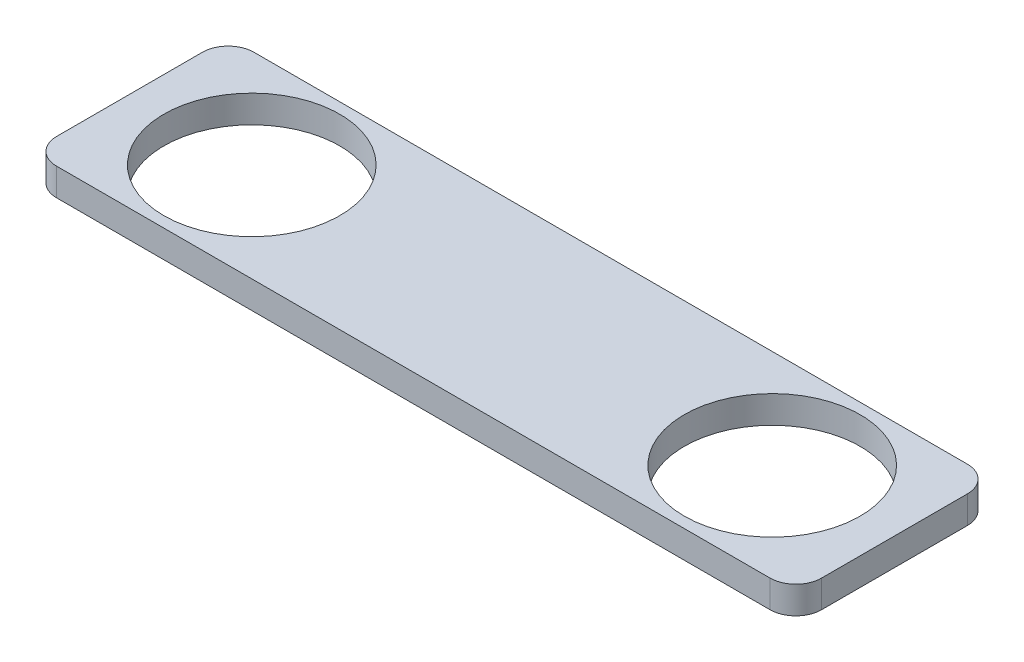
ISO-10303-21;
HEADER;
FILE_DESCRIPTION(('STEP AP214'),'2;1');
FILE_NAME('part.step','',(''),(''),'','','');
FILE_SCHEMA(('AUTOMOTIVE_DESIGN { 1 0 10303 214 1 1 1 1 }'));
ENDSEC;
DATA;
#1=APPLICATION_CONTEXT('core data for automotive mechanical design processes');
#2=APPLICATION_PROTOCOL_DEFINITION('international standard','automotive_design',2000,#1);
#3=PRODUCT_CONTEXT('',#1,'mechanical');
#4=PRODUCT('Part','Part','',(#3));
#5=PRODUCT_RELATED_PRODUCT_CATEGORY('part','',(#4));
#6=PRODUCT_DEFINITION_FORMATION('','',#4);
#7=PRODUCT_DEFINITION_CONTEXT('part definition',#1,'design');
#8=PRODUCT_DEFINITION('design','',#6,#7);
#9=PRODUCT_DEFINITION_SHAPE('','',#8);
#10=(LENGTH_UNIT() NAMED_UNIT(*) SI_UNIT(.MILLI.,.METRE.));
#11=(NAMED_UNIT(*) PLANE_ANGLE_UNIT() SI_UNIT($,.RADIAN.));
#12=(NAMED_UNIT(*) SI_UNIT($,.STERADIAN.) SOLID_ANGLE_UNIT());
#13=UNCERTAINTY_MEASURE_WITH_UNIT(LENGTH_MEASURE(1.E-05),#10,'distance_accuracy_value','');
#14=(GEOMETRIC_REPRESENTATION_CONTEXT(3) GLOBAL_UNCERTAINTY_ASSIGNED_CONTEXT((#13)) GLOBAL_UNIT_ASSIGNED_CONTEXT((#10,
#11,#12)) REPRESENTATION_CONTEXT('',''));
#15=CARTESIAN_POINT('',(0.,0.,0.));
#16=DIRECTION('',(0.,0.,1.));
#17=DIRECTION('',(1.,0.,0.));
#18=AXIS2_PLACEMENT_3D('',#15,#16,#17);
#19=CARTESIAN_POINT('',(-44.578,3.2,11.5));
#20=DIRECTION('',(1.,0.,0.));
#21=DIRECTION('',(0.,0.,1.));
#22=AXIS2_PLACEMENT_3D('',#19,#20,#21);
#23=PLANE('',#22);
#24=DIRECTION('',(0.,0.,1.));
#25=VECTOR('',#24,1.);
#26=CARTESIAN_POINT('',(-44.578,3.2,11.5));
#27=LINE('',#26,#25);
#28=CARTESIAN_POINT('',(-44.578,3.2,-8.5));
#29=VERTEX_POINT('',#28);
#30=CARTESIAN_POINT('',(-44.578,3.2,8.5));
#31=VERTEX_POINT('',#30);
#32=EDGE_CURVE('E146',#29,#31,#27,.T.);
#33=ORIENTED_EDGE('',*,*,#32,.F.);
#34=DIRECTION('',(0.,-1.,0.));
#35=VECTOR('',#34,1.);
#36=CARTESIAN_POINT('',(-44.578,3.2,-8.5));
#37=LINE('',#36,#35);
#38=CARTESIAN_POINT('',(-44.578,0.,-8.5));
#39=VERTEX_POINT('',#38);
#40=EDGE_CURVE('E11',#29,#39,#37,.T.);
#41=ORIENTED_EDGE('',*,*,#40,.T.);
#42=DIRECTION('',(0.,0.,-1.));
#43=VECTOR('',#42,1.);
#44=CARTESIAN_POINT('',(-44.578,0.,0.));
#45=LINE('',#44,#43);
#46=CARTESIAN_POINT('',(-44.578,0.,8.5));
#47=VERTEX_POINT('',#46);
#48=EDGE_CURVE('E147',#39,#47,#45,.F.);
#49=ORIENTED_EDGE('',*,*,#48,.T.);
#50=DIRECTION('',(0.,-1.,0.));
#51=VECTOR('',#50,1.);
#52=CARTESIAN_POINT('',(-44.578,3.2,8.5));
#53=LINE('',#52,#51);
#54=EDGE_CURVE('E51',#47,#31,#53,.F.);
#55=ORIENTED_EDGE('',*,*,#54,.T.);
#56=EDGE_LOOP('',(#33,#41,#49,#55));
#57=FACE_BOUND('',#56,.T.);
#58=ADVANCED_FACE('F43',(#57),#23,.F.);
#59=CARTESIAN_POINT('',(-44.578,3.2,11.5));
#60=DIRECTION('',(0.,0.,-1.));
#61=DIRECTION('',(1.,0.,0.));
#62=AXIS2_PLACEMENT_3D('',#59,#60,#61);
#63=PLANE('',#62);
#64=DIRECTION('',(1.,0.,0.));
#65=VECTOR('',#64,1.);
#66=CARTESIAN_POINT('',(0.,0.,11.5));
#67=LINE('',#66,#65);
#68=CARTESIAN_POINT('',(-41.578,0.,11.5));
#69=VERTEX_POINT('',#68);
#70=CARTESIAN_POINT('',(41.578,0.,11.5));
#71=VERTEX_POINT('',#70);
#72=EDGE_CURVE('E169',#69,#71,#67,.T.);
#73=ORIENTED_EDGE('',*,*,#72,.T.);
#74=DIRECTION('',(0.,-1.,0.));
#75=VECTOR('',#74,1.);
#76=CARTESIAN_POINT('',(41.578,3.2,11.5));
#77=LINE('',#76,#75);
#78=CARTESIAN_POINT('',(41.578,3.2,11.5));
#79=VERTEX_POINT('',#78);
#80=EDGE_CURVE('E134',#71,#79,#77,.F.);
#81=ORIENTED_EDGE('',*,*,#80,.T.);
#82=DIRECTION('',(1.,0.,0.));
#83=VECTOR('',#82,1.);
#84=CARTESIAN_POINT('',(-44.578,3.2,11.5));
#85=LINE('',#84,#83);
#86=CARTESIAN_POINT('',(-41.578,3.2,11.5));
#87=VERTEX_POINT('',#86);
#88=EDGE_CURVE('E157',#87,#79,#85,.T.);
#89=ORIENTED_EDGE('',*,*,#88,.F.);
#90=DIRECTION('',(0.,-1.,0.));
#91=VECTOR('',#90,1.);
#92=CARTESIAN_POINT('',(-41.578,3.2,11.5));
#93=LINE('',#92,#91);
#94=EDGE_CURVE('E137',#87,#69,#93,.T.);
#95=ORIENTED_EDGE('',*,*,#94,.T.);
#96=EDGE_LOOP('',(#73,#81,#89,#95));
#97=FACE_BOUND('',#96,.T.);
#98=ADVANCED_FACE('F200',(#97),#63,.F.);
#99=CARTESIAN_POINT('',(44.578,3.2,11.5));
#100=DIRECTION('',(-1.,0.,0.));
#101=DIRECTION('',(0.,0.,-1.));
#102=AXIS2_PLACEMENT_3D('',#99,#100,#101);
#103=PLANE('',#102);
#104=DIRECTION('',(0.,0.,-1.));
#105=VECTOR('',#104,1.);
#106=CARTESIAN_POINT('',(44.578,0.,0.));
#107=LINE('',#106,#105);
#108=CARTESIAN_POINT('',(44.578,0.,8.5));
#109=VERTEX_POINT('',#108);
#110=CARTESIAN_POINT('',(44.578,0.,-8.5));
#111=VERTEX_POINT('',#110);
#112=EDGE_CURVE('E113',#109,#111,#107,.T.);
#113=ORIENTED_EDGE('',*,*,#112,.T.);
#114=DIRECTION('',(0.,-1.,0.));
#115=VECTOR('',#114,1.);
#116=CARTESIAN_POINT('',(44.578,3.2,-8.5));
#117=LINE('',#116,#115);
#118=CARTESIAN_POINT('',(44.578,3.2,-8.5));
#119=VERTEX_POINT('',#118);
#120=EDGE_CURVE('E119',#111,#119,#117,.F.);
#121=ORIENTED_EDGE('',*,*,#120,.T.);
#122=DIRECTION('',(0.,0.,-1.));
#123=VECTOR('',#122,1.);
#124=CARTESIAN_POINT('',(44.578,3.2,11.5));
#125=LINE('',#124,#123);
#126=CARTESIAN_POINT('',(44.578,3.2,8.5));
#127=VERTEX_POINT('',#126);
#128=EDGE_CURVE('E116',#127,#119,#125,.T.);
#129=ORIENTED_EDGE('',*,*,#128,.F.);
#130=DIRECTION('',(0.,-1.,0.));
#131=VECTOR('',#130,1.);
#132=CARTESIAN_POINT('',(44.578,3.2,8.5));
#133=LINE('',#132,#131);
#134=EDGE_CURVE('E109',#127,#109,#133,.T.);
#135=ORIENTED_EDGE('',*,*,#134,.T.);
#136=EDGE_LOOP('',(#113,#121,#129,#135));
#137=FACE_BOUND('',#136,.T.);
#138=ADVANCED_FACE('F111',(#137),#103,.F.);
#139=CARTESIAN_POINT('',(-44.578,3.2,-11.5));
#140=DIRECTION('',(0.,0.,1.));
#141=DIRECTION('',(-1.,0.,0.));
#142=AXIS2_PLACEMENT_3D('',#139,#140,#141);
#143=PLANE('',#142);
#144=DIRECTION('',(-1.,0.,0.));
#145=VECTOR('',#144,1.);
#146=CARTESIAN_POINT('',(-44.578,3.2,-11.5));
#147=LINE('',#146,#145);
#148=CARTESIAN_POINT('',(41.578,3.2,-11.5));
#149=VERTEX_POINT('',#148);
#150=CARTESIAN_POINT('',(-41.578,3.2,-11.5));
#151=VERTEX_POINT('',#150);
#152=EDGE_CURVE('E158',#149,#151,#147,.T.);
#153=ORIENTED_EDGE('',*,*,#152,.F.);
#154=DIRECTION('',(0.,-1.,0.));
#155=VECTOR('',#154,1.);
#156=CARTESIAN_POINT('',(41.578,3.2,-11.5));
#157=LINE('',#156,#155);
#158=CARTESIAN_POINT('',(41.578,0.,-11.5));
#159=VERTEX_POINT('',#158);
#160=EDGE_CURVE('E190',#149,#159,#157,.T.);
#161=ORIENTED_EDGE('',*,*,#160,.T.);
#162=DIRECTION('',(1.,0.,0.));
#163=VECTOR('',#162,1.);
#164=CARTESIAN_POINT('',(0.,0.,-11.5));
#165=LINE('',#164,#163);
#166=CARTESIAN_POINT('',(-41.578,0.,-11.5));
#167=VERTEX_POINT('',#166);
#168=EDGE_CURVE('E129',#159,#167,#165,.F.);
#169=ORIENTED_EDGE('',*,*,#168,.T.);
#170=DIRECTION('',(0.,-1.,0.));
#171=VECTOR('',#170,1.);
#172=CARTESIAN_POINT('',(-41.578,3.2,-11.5));
#173=LINE('',#172,#171);
#174=EDGE_CURVE('E187',#167,#151,#173,.F.);
#175=ORIENTED_EDGE('',*,*,#174,.T.);
#176=EDGE_LOOP('',(#153,#161,#169,#175));
#177=FACE_BOUND('',#176,.T.);
#178=ADVANCED_FACE('F194',(#177),#143,.F.);
#179=CARTESIAN_POINT('',(30.328,3.2,0.));
#180=DIRECTION('',(0.,-1.,0.));
#181=DIRECTION('',(0.,0.,-1.));
#182=AXIS2_PLACEMENT_3D('',#179,#180,#181);
#183=CYLINDRICAL_SURFACE('',#182,10.25);
#184=CARTESIAN_POINT('',(30.328,3.2,0.));
#185=DIRECTION('',(0.,1.,0.));
#186=DIRECTION('',(0.,0.,1.));
#187=AXIS2_PLACEMENT_3D('',#184,#185,#186);
#188=CIRCLE('',#187,10.25);
#189=CARTESIAN_POINT('',(30.328,3.2,10.25));
#190=VERTEX_POINT('',#189);
#191=EDGE_CURVE('E160',#190,#190,#188,.T.);
#192=ORIENTED_EDGE('',*,*,#191,.T.);
#193=EDGE_LOOP('',(#192));
#194=FACE_BOUND('',#193,.T.);
#195=CARTESIAN_POINT('',(30.328,0.,0.));
#196=DIRECTION('',(0.,1.,0.));
#197=DIRECTION('',(0.,0.,1.));
#198=AXIS2_PLACEMENT_3D('',#195,#196,#197);
#199=CIRCLE('',#198,10.25);
#200=CARTESIAN_POINT('',(30.328,0.,10.25));
#201=VERTEX_POINT('',#200);
#202=EDGE_CURVE('E171',#201,#201,#199,.T.);
#203=ORIENTED_EDGE('',*,*,#202,.F.);
#204=EDGE_LOOP('',(#203));
#205=FACE_BOUND('',#204,.T.);
#206=ADVANCED_FACE('F219',(#194,#205),#183,.F.);
#207=CARTESIAN_POINT('',(-30.328,3.2,0.));
#208=DIRECTION('',(0.,-1.,0.));
#209=DIRECTION('',(0.,0.,-1.));
#210=AXIS2_PLACEMENT_3D('',#207,#208,#209);
#211=CYLINDRICAL_SURFACE('',#210,10.25);
#212=CARTESIAN_POINT('',(-30.328,3.2,0.));
#213=DIRECTION('',(0.,1.,0.));
#214=DIRECTION('',(0.,0.,1.));
#215=AXIS2_PLACEMENT_3D('',#212,#213,#214);
#216=CIRCLE('',#215,10.25);
#217=CARTESIAN_POINT('',(-30.328,3.2,10.25));
#218=VERTEX_POINT('',#217);
#219=EDGE_CURVE('E120',#218,#218,#216,.T.);
#220=ORIENTED_EDGE('',*,*,#219,.T.);
#221=EDGE_LOOP('',(#220));
#222=FACE_BOUND('',#221,.T.);
#223=CARTESIAN_POINT('',(-30.328,0.,0.));
#224=DIRECTION('',(0.,1.,0.));
#225=DIRECTION('',(0.,0.,1.));
#226=AXIS2_PLACEMENT_3D('',#223,#224,#225);
#227=CIRCLE('',#226,10.25);
#228=CARTESIAN_POINT('',(-30.328,0.,10.25));
#229=VERTEX_POINT('',#228);
#230=EDGE_CURVE('E177',#229,#229,#227,.T.);
#231=ORIENTED_EDGE('',*,*,#230,.F.);
#232=EDGE_LOOP('',(#231));
#233=FACE_BOUND('',#232,.T.);
#234=ADVANCED_FACE('F222',(#222,#233),#211,.F.);
#235=CARTESIAN_POINT('',(0.,3.2,0.));
#236=DIRECTION('',(0.,-1.,0.));
#237=DIRECTION('',(0.,0.,-1.));
#238=AXIS2_PLACEMENT_3D('',#235,#236,#237);
#239=PLANE('',#238);
#240=ORIENTED_EDGE('',*,*,#128,.T.);
#241=CARTESIAN_POINT('',(41.578,3.2,-8.5));
#242=DIRECTION('',(0.,-1.,0.));
#243=DIRECTION('',(0.,0.,-1.));
#244=AXIS2_PLACEMENT_3D('',#241,#242,#243);
#245=CIRCLE('',#244,3.);
#246=EDGE_CURVE('E185',#119,#149,#245,.F.);
#247=ORIENTED_EDGE('',*,*,#246,.T.);
#248=ORIENTED_EDGE('',*,*,#152,.T.);
#249=CARTESIAN_POINT('',(-41.578,3.2,-8.5));
#250=DIRECTION('',(0.,-1.,0.));
#251=DIRECTION('',(0.,0.,-1.));
#252=AXIS2_PLACEMENT_3D('',#249,#250,#251);
#253=CIRCLE('',#252,3.);
#254=EDGE_CURVE('E156',#151,#29,#253,.F.);
#255=ORIENTED_EDGE('',*,*,#254,.T.);
#256=ORIENTED_EDGE('',*,*,#32,.T.);
#257=CARTESIAN_POINT('',(-41.578,3.2,8.5));
#258=DIRECTION('',(0.,-1.,0.));
#259=DIRECTION('',(0.,0.,-1.));
#260=AXIS2_PLACEMENT_3D('',#257,#258,#259);
#261=CIRCLE('',#260,3.);
#262=EDGE_CURVE('E153',#31,#87,#261,.F.);
#263=ORIENTED_EDGE('',*,*,#262,.T.);
#264=ORIENTED_EDGE('',*,*,#88,.T.);
#265=CARTESIAN_POINT('',(41.578,3.2,8.5));
#266=DIRECTION('',(0.,-1.,0.));
#267=DIRECTION('',(0.,0.,-1.));
#268=AXIS2_PLACEMENT_3D('',#265,#266,#267);
#269=CIRCLE('',#268,3.);
#270=EDGE_CURVE('E183',#79,#127,#269,.F.);
#271=ORIENTED_EDGE('',*,*,#270,.T.);
#272=EDGE_LOOP('',(#240,#247,#248,#255,#256,#263,#264,#271));
#273=FACE_BOUND('',#272,.T.);
#274=ORIENTED_EDGE('',*,*,#191,.F.);
#275=EDGE_LOOP('',(#274));
#276=FACE_BOUND('',#275,.T.);
#277=ORIENTED_EDGE('',*,*,#219,.F.);
#278=EDGE_LOOP('',(#277));
#279=FACE_BOUND('',#278,.T.);
#280=ADVANCED_FACE('F150',(#273,#276,#279),#239,.F.);
#281=CARTESIAN_POINT('',(0.,0.,0.));
#282=DIRECTION('',(0.,-1.,0.));
#283=DIRECTION('',(0.,0.,-1.));
#284=AXIS2_PLACEMENT_3D('',#281,#282,#283);
#285=PLANE('',#284);
#286=ORIENTED_EDGE('',*,*,#168,.F.);
#287=CARTESIAN_POINT('',(41.578,0.,-8.5));
#288=DIRECTION('',(0.,-1.,0.));
#289=DIRECTION('',(0.,0.,-1.));
#290=AXIS2_PLACEMENT_3D('',#287,#288,#289);
#291=CIRCLE('',#290,3.);
#292=EDGE_CURVE('E128',#159,#111,#291,.T.);
#293=ORIENTED_EDGE('',*,*,#292,.T.);
#294=ORIENTED_EDGE('',*,*,#112,.F.);
#295=CARTESIAN_POINT('',(41.578,0.,8.5));
#296=DIRECTION('',(0.,-1.,0.));
#297=DIRECTION('',(0.,0.,-1.));
#298=AXIS2_PLACEMENT_3D('',#295,#296,#297);
#299=CIRCLE('',#298,3.);
#300=EDGE_CURVE('E125',#109,#71,#299,.T.);
#301=ORIENTED_EDGE('',*,*,#300,.T.);
#302=ORIENTED_EDGE('',*,*,#72,.F.);
#303=CARTESIAN_POINT('',(-41.578,0.,8.5));
#304=DIRECTION('',(0.,-1.,0.));
#305=DIRECTION('',(0.,0.,-1.));
#306=AXIS2_PLACEMENT_3D('',#303,#304,#305);
#307=CIRCLE('',#306,3.);
#308=EDGE_CURVE('E58',#69,#47,#307,.T.);
#309=ORIENTED_EDGE('',*,*,#308,.T.);
#310=ORIENTED_EDGE('',*,*,#48,.F.);
#311=CARTESIAN_POINT('',(-41.578,0.,-8.5));
#312=DIRECTION('',(0.,-1.,0.));
#313=DIRECTION('',(0.,0.,-1.));
#314=AXIS2_PLACEMENT_3D('',#311,#312,#313);
#315=CIRCLE('',#314,3.);
#316=EDGE_CURVE('E135',#39,#167,#315,.T.);
#317=ORIENTED_EDGE('',*,*,#316,.T.);
#318=EDGE_LOOP('',(#286,#293,#294,#301,#302,#309,#310,#317));
#319=FACE_BOUND('',#318,.T.);
#320=ORIENTED_EDGE('',*,*,#202,.T.);
#321=EDGE_LOOP('',(#320));
#322=FACE_BOUND('',#321,.T.);
#323=ORIENTED_EDGE('',*,*,#230,.T.);
#324=EDGE_LOOP('',(#323));
#325=FACE_BOUND('',#324,.T.);
#326=ADVANCED_FACE('F123',(#319,#322,#325),#285,.T.);
#327=CARTESIAN_POINT('',(41.578,3.2,-8.5));
#328=DIRECTION('',(0.,1.,0.));
#329=DIRECTION('',(0.,0.,1.));
#330=AXIS2_PLACEMENT_3D('',#327,#328,#329);
#331=CYLINDRICAL_SURFACE('',#330,3.);
#332=ORIENTED_EDGE('',*,*,#292,.F.);
#333=ORIENTED_EDGE('',*,*,#160,.F.);
#334=ORIENTED_EDGE('',*,*,#246,.F.);
#335=ORIENTED_EDGE('',*,*,#120,.F.);
#336=EDGE_LOOP('',(#332,#333,#334,#335));
#337=FACE_BOUND('',#336,.T.);
#338=ADVANCED_FACE('F198',(#337),#331,.T.);
#339=CARTESIAN_POINT('',(41.578,3.2,8.5));
#340=DIRECTION('',(0.,1.,0.));
#341=DIRECTION('',(0.,0.,1.));
#342=AXIS2_PLACEMENT_3D('',#339,#340,#341);
#343=CYLINDRICAL_SURFACE('',#342,3.);
#344=ORIENTED_EDGE('',*,*,#300,.F.);
#345=ORIENTED_EDGE('',*,*,#134,.F.);
#346=ORIENTED_EDGE('',*,*,#270,.F.);
#347=ORIENTED_EDGE('',*,*,#80,.F.);
#348=EDGE_LOOP('',(#344,#345,#346,#347));
#349=FACE_BOUND('',#348,.T.);
#350=ADVANCED_FACE('F132',(#349),#343,.T.);
#351=CARTESIAN_POINT('',(-41.578,3.2,-8.5));
#352=DIRECTION('',(0.,1.,0.));
#353=DIRECTION('',(0.,0.,1.));
#354=AXIS2_PLACEMENT_3D('',#351,#352,#353);
#355=CYLINDRICAL_SURFACE('',#354,3.);
#356=ORIENTED_EDGE('',*,*,#316,.F.);
#357=ORIENTED_EDGE('',*,*,#40,.F.);
#358=ORIENTED_EDGE('',*,*,#254,.F.);
#359=ORIENTED_EDGE('',*,*,#174,.F.);
#360=EDGE_LOOP('',(#356,#357,#358,#359));
#361=FACE_BOUND('',#360,.T.);
#362=ADVANCED_FACE('F203',(#361),#355,.T.);
#363=CARTESIAN_POINT('',(-41.578,3.2,8.5));
#364=DIRECTION('',(0.,1.,0.));
#365=DIRECTION('',(0.,0.,1.));
#366=AXIS2_PLACEMENT_3D('',#363,#364,#365);
#367=CYLINDRICAL_SURFACE('',#366,3.);
#368=ORIENTED_EDGE('',*,*,#308,.F.);
#369=ORIENTED_EDGE('',*,*,#94,.F.);
#370=ORIENTED_EDGE('',*,*,#262,.F.);
#371=ORIENTED_EDGE('',*,*,#54,.F.);
#372=EDGE_LOOP('',(#368,#369,#370,#371));
#373=FACE_BOUND('',#372,.T.);
#374=ADVANCED_FACE('F45',(#373),#367,.T.);
#375=CLOSED_SHELL('',(#58,#98,#138,#178,#206,#234,#280,#326,#338,#350,#362,#374));
#376=MANIFOLD_SOLID_BREP('B2',#375);
#377=ADVANCED_BREP_SHAPE_REPRESENTATION('',(#18,#376),#14);
#378=SHAPE_DEFINITION_REPRESENTATION(#9,#377);
ENDSEC;
END-ISO-10303-21;
